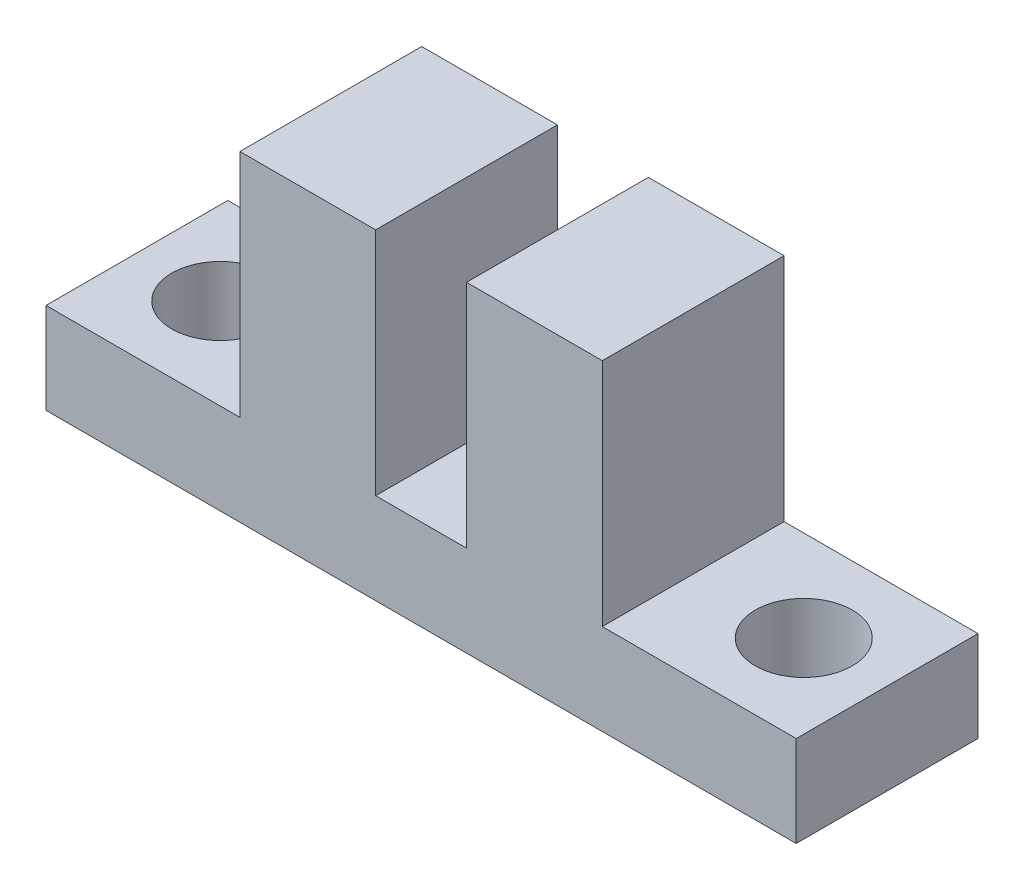
ISO-10303-21;
HEADER;
FILE_DESCRIPTION(('STEP AP214'),'2;1');
FILE_NAME('part.step','',(''),(''),'','','');
FILE_SCHEMA(('AUTOMOTIVE_DESIGN { 1 0 10303 214 1 1 1 1 }'));
ENDSEC;
DATA;
#1=APPLICATION_CONTEXT('core data for automotive mechanical design processes');
#2=APPLICATION_PROTOCOL_DEFINITION('international standard','automotive_design',2000,#1);
#3=PRODUCT_CONTEXT('',#1,'mechanical');
#4=PRODUCT('Part','Part','',(#3));
#5=PRODUCT_RELATED_PRODUCT_CATEGORY('part','',(#4));
#6=PRODUCT_DEFINITION_FORMATION('','',#4);
#7=PRODUCT_DEFINITION_CONTEXT('part definition',#1,'design');
#8=PRODUCT_DEFINITION('design','',#6,#7);
#9=PRODUCT_DEFINITION_SHAPE('','',#8);
#10=(LENGTH_UNIT() NAMED_UNIT(*) SI_UNIT(.MILLI.,.METRE.));
#11=(NAMED_UNIT(*) PLANE_ANGLE_UNIT() SI_UNIT($,.RADIAN.));
#12=(NAMED_UNIT(*) SI_UNIT($,.STERADIAN.) SOLID_ANGLE_UNIT());
#13=UNCERTAINTY_MEASURE_WITH_UNIT(LENGTH_MEASURE(1.E-05),#10,'distance_accuracy_value','');
#14=(GEOMETRIC_REPRESENTATION_CONTEXT(3) GLOBAL_UNCERTAINTY_ASSIGNED_CONTEXT((#13)) GLOBAL_UNIT_ASSIGNED_CONTEXT((#10,
#11,#12)) REPRESENTATION_CONTEXT('',''));
#15=CARTESIAN_POINT('',(0.,0.,0.));
#16=DIRECTION('',(0.,0.,1.));
#17=DIRECTION('',(1.,0.,0.));
#18=AXIS2_PLACEMENT_3D('',#15,#16,#17);
#19=CARTESIAN_POINT('',(-9.46757575757575,-2.10181818181819,6.));
#20=DIRECTION('',(1.,0.,0.));
#21=DIRECTION('',(0.,0.,-1.));
#22=AXIS2_PLACEMENT_3D('',#19,#20,#21);
#23=PLANE('',#22);
#24=DIRECTION('',(0.,-1.,0.));
#25=VECTOR('',#24,1.);
#26=CARTESIAN_POINT('',(-9.46757575757575,-2.10181818181819,0.));
#27=LINE('',#26,#25);
#28=CARTESIAN_POINT('',(-9.46757575757575,5.49818181818181,0.));
#29=VERTEX_POINT('',#28);
#30=CARTESIAN_POINT('',(-9.46757575757575,-2.10181818181819,0.));
#31=VERTEX_POINT('',#30);
#32=EDGE_CURVE('E153',#29,#31,#27,.T.);
#33=ORIENTED_EDGE('',*,*,#32,.T.);
#34=DIRECTION('',(0.,0.,-1.));
#35=VECTOR('',#34,1.);
#36=CARTESIAN_POINT('',(-9.46757575757575,-2.10181818181819,6.));
#37=LINE('',#36,#35);
#38=CARTESIAN_POINT('',(-9.46757575757575,-2.10181818181819,6.));
#39=VERTEX_POINT('',#38);
#40=EDGE_CURVE('E11',#39,#31,#37,.T.);
#41=ORIENTED_EDGE('',*,*,#40,.F.);
#42=DIRECTION('',(0.,-1.,0.));
#43=VECTOR('',#42,1.);
#44=CARTESIAN_POINT('',(-9.46757575757575,-2.10181818181819,6.));
#45=LINE('',#44,#43);
#46=CARTESIAN_POINT('',(-9.46757575757575,5.49818181818181,6.));
#47=VERTEX_POINT('',#46);
#48=EDGE_CURVE('E176',#47,#39,#45,.T.);
#49=ORIENTED_EDGE('',*,*,#48,.F.);
#50=DIRECTION('',(0.,0.,-1.));
#51=VECTOR('',#50,1.);
#52=CARTESIAN_POINT('',(-9.46757575757575,5.49818181818181,6.));
#53=LINE('',#52,#51);
#54=EDGE_CURVE('E149',#47,#29,#53,.T.);
#55=ORIENTED_EDGE('',*,*,#54,.T.);
#56=EDGE_LOOP('',(#33,#41,#49,#55));
#57=FACE_BOUND('',#56,.T.);
#58=ADVANCED_FACE('F33',(#57),#23,.F.);
#59=CARTESIAN_POINT('',(-15.8675757575758,-2.10181818181819,6.));
#60=DIRECTION('',(0.,-1.,0.));
#61=DIRECTION('',(0.,0.,-1.));
#62=AXIS2_PLACEMENT_3D('',#59,#60,#61);
#63=PLANE('',#62);
#64=CARTESIAN_POINT('',(-13.1175757575758,-2.10181818181819,3.));
#65=DIRECTION('',(0.,1.,0.));
#66=DIRECTION('',(0.,0.,1.));
#67=AXIS2_PLACEMENT_3D('',#64,#65,#66);
#68=CIRCLE('',#67,1.6);
#69=CARTESIAN_POINT('',(-13.1175757575758,-2.10181818181819,4.6));
#70=VERTEX_POINT('',#69);
#71=EDGE_CURVE('E356',#70,#70,#68,.T.);
#72=ORIENTED_EDGE('',*,*,#71,.F.);
#73=EDGE_LOOP('',(#72));
#74=FACE_BOUND('',#73,.T.);
#75=DIRECTION('',(-1.,0.,0.));
#76=VECTOR('',#75,1.);
#77=CARTESIAN_POINT('',(-15.8675757575758,-2.10181818181819,0.));
#78=LINE('',#77,#76);
#79=CARTESIAN_POINT('',(-15.8675757575758,-2.10181818181819,0.));
#80=VERTEX_POINT('',#79);
#81=EDGE_CURVE('E156',#31,#80,#78,.T.);
#82=ORIENTED_EDGE('',*,*,#81,.T.);
#83=DIRECTION('',(0.,0.,-1.));
#84=VECTOR('',#83,1.);
#85=CARTESIAN_POINT('',(-15.8675757575758,-2.10181818181819,6.));
#86=LINE('',#85,#84);
#87=CARTESIAN_POINT('',(-15.8675757575758,-2.10181818181819,6.));
#88=VERTEX_POINT('',#87);
#89=EDGE_CURVE('E41',#88,#80,#86,.T.);
#90=ORIENTED_EDGE('',*,*,#89,.F.);
#91=DIRECTION('',(-1.,0.,0.));
#92=VECTOR('',#91,1.);
#93=CARTESIAN_POINT('',(-15.8675757575758,-2.10181818181819,6.));
#94=LINE('',#93,#92);
#95=EDGE_CURVE('E104',#39,#88,#94,.T.);
#96=ORIENTED_EDGE('',*,*,#95,.F.);
#97=ORIENTED_EDGE('',*,*,#40,.T.);
#98=EDGE_LOOP('',(#82,#90,#96,#97));
#99=FACE_BOUND('',#98,.T.);
#100=ADVANCED_FACE('F254',(#74,#99),#63,.F.);
#101=CARTESIAN_POINT('',(-15.8675757575758,-5.10181818181819,6.));
#102=DIRECTION('',(1.,0.,0.));
#103=DIRECTION('',(0.,0.,-1.));
#104=AXIS2_PLACEMENT_3D('',#101,#102,#103);
#105=PLANE('',#104);
#106=DIRECTION('',(0.,-1.,0.));
#107=VECTOR('',#106,1.);
#108=CARTESIAN_POINT('',(-15.8675757575758,-5.10181818181819,0.));
#109=LINE('',#108,#107);
#110=CARTESIAN_POINT('',(-15.8675757575758,-5.10181818181819,0.));
#111=VERTEX_POINT('',#110);
#112=EDGE_CURVE('E159',#80,#111,#109,.T.);
#113=ORIENTED_EDGE('',*,*,#112,.T.);
#114=DIRECTION('',(0.,0.,-1.));
#115=VECTOR('',#114,1.);
#116=CARTESIAN_POINT('',(-15.8675757575758,-5.10181818181819,6.));
#117=LINE('',#116,#115);
#118=CARTESIAN_POINT('',(-15.8675757575758,-5.10181818181819,6.));
#119=VERTEX_POINT('',#118);
#120=EDGE_CURVE('E195',#119,#111,#117,.T.);
#121=ORIENTED_EDGE('',*,*,#120,.F.);
#122=DIRECTION('',(0.,-1.,0.));
#123=VECTOR('',#122,1.);
#124=CARTESIAN_POINT('',(-15.8675757575758,-5.10181818181819,6.));
#125=LINE('',#124,#123);
#126=EDGE_CURVE('E203',#88,#119,#125,.T.);
#127=ORIENTED_EDGE('',*,*,#126,.F.);
#128=ORIENTED_EDGE('',*,*,#89,.T.);
#129=EDGE_LOOP('',(#113,#121,#127,#128));
#130=FACE_BOUND('',#129,.T.);
#131=ADVANCED_FACE('F201',(#130),#105,.F.);
#132=CARTESIAN_POINT('',(8.89242424242425,-5.10181818181818,6.));
#133=DIRECTION('',(0.,1.,0.));
#134=DIRECTION('',(-1.,0.,0.));
#135=AXIS2_PLACEMENT_3D('',#132,#133,#134);
#136=PLANE('',#135);
#137=CARTESIAN_POINT('',(-13.1175757575758,-5.10181818181819,3.));
#138=DIRECTION('',(0.,1.,0.));
#139=DIRECTION('',(0.,0.,1.));
#140=AXIS2_PLACEMENT_3D('',#137,#138,#139);
#141=CIRCLE('',#140,1.6);
#142=CARTESIAN_POINT('',(-13.1175757575758,-5.10181818181819,4.6));
#143=VERTEX_POINT('',#142);
#144=EDGE_CURVE('E157',#143,#143,#141,.T.);
#145=ORIENTED_EDGE('',*,*,#144,.T.);
#146=EDGE_LOOP('',(#145));
#147=FACE_BOUND('',#146,.T.);
#148=CARTESIAN_POINT('',(6.14242424242425,-5.10181818181819,3.));
#149=DIRECTION('',(0.,1.,0.));
#150=DIRECTION('',(0.,0.,-1.));
#151=AXIS2_PLACEMENT_3D('',#148,#149,#150);
#152=CIRCLE('',#151,1.6);
#153=CARTESIAN_POINT('',(6.14242424242425,-5.10181818181819,1.4));
#154=VERTEX_POINT('',#153);
#155=EDGE_CURVE('E357',#154,#154,#152,.T.);
#156=ORIENTED_EDGE('',*,*,#155,.T.);
#157=EDGE_LOOP('',(#156));
#158=FACE_BOUND('',#157,.T.);
#159=DIRECTION('',(1.,0.,0.));
#160=VECTOR('',#159,1.);
#161=CARTESIAN_POINT('',(8.89242424242425,-5.10181818181818,0.));
#162=LINE('',#161,#160);
#163=CARTESIAN_POINT('',(8.89242424242425,-5.10181818181818,0.));
#164=VERTEX_POINT('',#163);
#165=EDGE_CURVE('E161',#111,#164,#162,.T.);
#166=ORIENTED_EDGE('',*,*,#165,.T.);
#167=DIRECTION('',(0.,0.,-1.));
#168=VECTOR('',#167,1.);
#169=CARTESIAN_POINT('',(8.89242424242425,-5.10181818181818,6.));
#170=LINE('',#169,#168);
#171=CARTESIAN_POINT('',(8.89242424242425,-5.10181818181818,6.));
#172=VERTEX_POINT('',#171);
#173=EDGE_CURVE('E192',#172,#164,#170,.T.);
#174=ORIENTED_EDGE('',*,*,#173,.F.);
#175=DIRECTION('',(1.,0.,0.));
#176=VECTOR('',#175,1.);
#177=CARTESIAN_POINT('',(8.89242424242425,-5.10181818181818,6.));
#178=LINE('',#177,#176);
#179=EDGE_CURVE('E221',#119,#172,#178,.T.);
#180=ORIENTED_EDGE('',*,*,#179,.F.);
#181=ORIENTED_EDGE('',*,*,#120,.T.);
#182=EDGE_LOOP('',(#166,#174,#180,#181));
#183=FACE_BOUND('',#182,.T.);
#184=ADVANCED_FACE('F212',(#147,#158,#183),#136,.F.);
#185=CARTESIAN_POINT('',(8.89242424242425,-2.10181818181819,6.));
#186=DIRECTION('',(-1.,0.,0.));
#187=DIRECTION('',(0.,0.,1.));
#188=AXIS2_PLACEMENT_3D('',#185,#186,#187);
#189=PLANE('',#188);
#190=DIRECTION('',(0.,1.,0.));
#191=VECTOR('',#190,1.);
#192=CARTESIAN_POINT('',(8.89242424242425,-2.10181818181819,0.));
#193=LINE('',#192,#191);
#194=CARTESIAN_POINT('',(8.89242424242425,-2.10181818181819,0.));
#195=VERTEX_POINT('',#194);
#196=EDGE_CURVE('E163',#164,#195,#193,.T.);
#197=ORIENTED_EDGE('',*,*,#196,.T.);
#198=DIRECTION('',(0.,0.,-1.));
#199=VECTOR('',#198,1.);
#200=CARTESIAN_POINT('',(8.89242424242425,-2.10181818181819,6.));
#201=LINE('',#200,#199);
#202=CARTESIAN_POINT('',(8.89242424242425,-2.10181818181819,6.));
#203=VERTEX_POINT('',#202);
#204=EDGE_CURVE('E189',#203,#195,#201,.T.);
#205=ORIENTED_EDGE('',*,*,#204,.F.);
#206=DIRECTION('',(0.,1.,0.));
#207=VECTOR('',#206,1.);
#208=CARTESIAN_POINT('',(8.89242424242425,-2.10181818181819,6.));
#209=LINE('',#208,#207);
#210=EDGE_CURVE('E218',#172,#203,#209,.T.);
#211=ORIENTED_EDGE('',*,*,#210,.F.);
#212=ORIENTED_EDGE('',*,*,#173,.T.);
#213=EDGE_LOOP('',(#197,#205,#211,#212));
#214=FACE_BOUND('',#213,.T.);
#215=ADVANCED_FACE('F216',(#214),#189,.F.);
#216=CARTESIAN_POINT('',(2.49242424242425,-2.10181818181819,6.));
#217=DIRECTION('',(0.,-1.,0.));
#218=DIRECTION('',(0.,0.,-1.));
#219=AXIS2_PLACEMENT_3D('',#216,#217,#218);
#220=PLANE('',#219);
#221=CARTESIAN_POINT('',(6.14242424242425,-2.10181818181819,3.));
#222=DIRECTION('',(0.,1.,0.));
#223=DIRECTION('',(0.,0.,-1.));
#224=AXIS2_PLACEMENT_3D('',#221,#222,#223);
#225=CIRCLE('',#224,1.6);
#226=CARTESIAN_POINT('',(6.14242424242425,-2.10181818181819,1.4));
#227=VERTEX_POINT('',#226);
#228=EDGE_CURVE('E361',#227,#227,#225,.T.);
#229=ORIENTED_EDGE('',*,*,#228,.F.);
#230=EDGE_LOOP('',(#229));
#231=FACE_BOUND('',#230,.T.);
#232=DIRECTION('',(-1.,0.,0.));
#233=VECTOR('',#232,1.);
#234=CARTESIAN_POINT('',(2.49242424242425,-2.10181818181819,0.));
#235=LINE('',#234,#233);
#236=CARTESIAN_POINT('',(2.49242424242425,-2.10181818181819,0.));
#237=VERTEX_POINT('',#236);
#238=EDGE_CURVE('E165',#195,#237,#235,.T.);
#239=ORIENTED_EDGE('',*,*,#238,.T.);
#240=DIRECTION('',(0.,0.,-1.));
#241=VECTOR('',#240,1.);
#242=CARTESIAN_POINT('',(2.49242424242425,-2.10181818181819,6.));
#243=LINE('',#242,#241);
#244=CARTESIAN_POINT('',(2.49242424242425,-2.10181818181819,6.));
#245=VERTEX_POINT('',#244);
#246=EDGE_CURVE('E186',#245,#237,#243,.T.);
#247=ORIENTED_EDGE('',*,*,#246,.F.);
#248=DIRECTION('',(-1.,0.,0.));
#249=VECTOR('',#248,1.);
#250=CARTESIAN_POINT('',(2.49242424242425,-2.10181818181819,6.));
#251=LINE('',#250,#249);
#252=EDGE_CURVE('E220',#203,#245,#251,.T.);
#253=ORIENTED_EDGE('',*,*,#252,.F.);
#254=ORIENTED_EDGE('',*,*,#204,.T.);
#255=EDGE_LOOP('',(#239,#247,#253,#254));
#256=FACE_BOUND('',#255,.T.);
#257=ADVANCED_FACE('F270',(#231,#256),#220,.F.);
#258=CARTESIAN_POINT('',(2.49242424242425,5.49818181818181,6.));
#259=DIRECTION('',(-1.,0.,0.));
#260=DIRECTION('',(0.,-1.,0.));
#261=AXIS2_PLACEMENT_3D('',#258,#259,#260);
#262=PLANE('',#261);
#263=DIRECTION('',(0.,1.,0.));
#264=VECTOR('',#263,1.);
#265=CARTESIAN_POINT('',(2.49242424242425,5.49818181818181,0.));
#266=LINE('',#265,#264);
#267=CARTESIAN_POINT('',(2.49242424242425,5.49818181818181,0.));
#268=VERTEX_POINT('',#267);
#269=EDGE_CURVE('E167',#237,#268,#266,.T.);
#270=ORIENTED_EDGE('',*,*,#269,.T.);
#271=DIRECTION('',(0.,0.,-1.));
#272=VECTOR('',#271,1.);
#273=CARTESIAN_POINT('',(2.49242424242425,5.49818181818181,6.));
#274=LINE('',#273,#272);
#275=CARTESIAN_POINT('',(2.49242424242425,5.49818181818181,6.));
#276=VERTEX_POINT('',#275);
#277=EDGE_CURVE('E183',#276,#268,#274,.T.);
#278=ORIENTED_EDGE('',*,*,#277,.F.);
#279=DIRECTION('',(0.,1.,0.));
#280=VECTOR('',#279,1.);
#281=CARTESIAN_POINT('',(2.49242424242425,5.49818181818181,6.));
#282=LINE('',#281,#280);
#283=EDGE_CURVE('E223',#245,#276,#282,.T.);
#284=ORIENTED_EDGE('',*,*,#283,.F.);
#285=ORIENTED_EDGE('',*,*,#246,.T.);
#286=EDGE_LOOP('',(#270,#278,#284,#285));
#287=FACE_BOUND('',#286,.T.);
#288=ADVANCED_FACE('F273',(#287),#262,.F.);
#289=CARTESIAN_POINT('',(-1.98757575757575,5.49818181818181,6.));
#290=DIRECTION('',(0.,-1.,0.));
#291=DIRECTION('',(0.,0.,-1.));
#292=AXIS2_PLACEMENT_3D('',#289,#290,#291);
#293=PLANE('',#292);
#294=DIRECTION('',(-1.,0.,0.));
#295=VECTOR('',#294,1.);
#296=CARTESIAN_POINT('',(-1.98757575757575,5.49818181818181,0.));
#297=LINE('',#296,#295);
#298=CARTESIAN_POINT('',(-1.98757575757575,5.49818181818181,0.));
#299=VERTEX_POINT('',#298);
#300=EDGE_CURVE('E169',#268,#299,#297,.T.);
#301=ORIENTED_EDGE('',*,*,#300,.T.);
#302=DIRECTION('',(0.,0.,-1.));
#303=VECTOR('',#302,1.);
#304=CARTESIAN_POINT('',(-1.98757575757575,5.49818181818181,6.));
#305=LINE('',#304,#303);
#306=CARTESIAN_POINT('',(-1.98757575757575,5.49818181818181,6.));
#307=VERTEX_POINT('',#306);
#308=EDGE_CURVE('E180',#307,#299,#305,.T.);
#309=ORIENTED_EDGE('',*,*,#308,.F.);
#310=DIRECTION('',(-1.,0.,0.));
#311=VECTOR('',#310,1.);
#312=CARTESIAN_POINT('',(-1.98757575757575,5.49818181818181,6.));
#313=LINE('',#312,#311);
#314=EDGE_CURVE('E229',#276,#307,#313,.T.);
#315=ORIENTED_EDGE('',*,*,#314,.F.);
#316=ORIENTED_EDGE('',*,*,#277,.T.);
#317=EDGE_LOOP('',(#301,#309,#315,#316));
#318=FACE_BOUND('',#317,.T.);
#319=ADVANCED_FACE('F235',(#318),#293,.F.);
#320=CARTESIAN_POINT('',(-1.98757575757575,-2.10181818181819,6.));
#321=DIRECTION('',(1.,0.,0.));
#322=DIRECTION('',(0.,0.,-1.));
#323=AXIS2_PLACEMENT_3D('',#320,#321,#322);
#324=PLANE('',#323);
#325=DIRECTION('',(0.,-1.,0.));
#326=VECTOR('',#325,1.);
#327=CARTESIAN_POINT('',(-1.98757575757575,-2.10181818181819,0.));
#328=LINE('',#327,#326);
#329=CARTESIAN_POINT('',(-1.98757575757575,-2.10181818181819,0.));
#330=VERTEX_POINT('',#329);
#331=EDGE_CURVE('E171',#299,#330,#328,.T.);
#332=ORIENTED_EDGE('',*,*,#331,.T.);
#333=DIRECTION('',(0.,0.,-1.));
#334=VECTOR('',#333,1.);
#335=CARTESIAN_POINT('',(-1.98757575757575,-2.10181818181819,6.));
#336=LINE('',#335,#334);
#337=CARTESIAN_POINT('',(-1.98757575757575,-2.10181818181819,6.));
#338=VERTEX_POINT('',#337);
#339=EDGE_CURVE('E144',#338,#330,#336,.T.);
#340=ORIENTED_EDGE('',*,*,#339,.F.);
#341=DIRECTION('',(0.,-1.,0.));
#342=VECTOR('',#341,1.);
#343=CARTESIAN_POINT('',(-1.98757575757575,-2.10181818181819,6.));
#344=LINE('',#343,#342);
#345=EDGE_CURVE('E135',#307,#338,#344,.T.);
#346=ORIENTED_EDGE('',*,*,#345,.F.);
#347=ORIENTED_EDGE('',*,*,#308,.T.);
#348=EDGE_LOOP('',(#332,#340,#346,#347));
#349=FACE_BOUND('',#348,.T.);
#350=ADVANCED_FACE('F239',(#349),#324,.F.);
#351=CARTESIAN_POINT('',(-4.98757575757575,-2.10181818181819,6.));
#352=DIRECTION('',(0.,-1.,0.));
#353=DIRECTION('',(0.,0.,-1.));
#354=AXIS2_PLACEMENT_3D('',#351,#352,#353);
#355=PLANE('',#354);
#356=DIRECTION('',(-1.,0.,0.));
#357=VECTOR('',#356,1.);
#358=CARTESIAN_POINT('',(-4.98757575757575,-2.10181818181819,0.));
#359=LINE('',#358,#357);
#360=CARTESIAN_POINT('',(-4.98757575757575,-2.10181818181819,0.));
#361=VERTEX_POINT('',#360);
#362=EDGE_CURVE('E143',#330,#361,#359,.T.);
#363=ORIENTED_EDGE('',*,*,#362,.T.);
#364=DIRECTION('',(0.,0.,-1.));
#365=VECTOR('',#364,1.);
#366=CARTESIAN_POINT('',(-4.98757575757575,-2.10181818181819,6.));
#367=LINE('',#366,#365);
#368=CARTESIAN_POINT('',(-4.98757575757575,-2.10181818181819,6.));
#369=VERTEX_POINT('',#368);
#370=EDGE_CURVE('E140',#369,#361,#367,.T.);
#371=ORIENTED_EDGE('',*,*,#370,.F.);
#372=DIRECTION('',(-1.,0.,0.));
#373=VECTOR('',#372,1.);
#374=CARTESIAN_POINT('',(-4.98757575757575,-2.10181818181819,6.));
#375=LINE('',#374,#373);
#376=EDGE_CURVE('E129',#338,#369,#375,.T.);
#377=ORIENTED_EDGE('',*,*,#376,.F.);
#378=ORIENTED_EDGE('',*,*,#339,.T.);
#379=EDGE_LOOP('',(#363,#371,#377,#378));
#380=FACE_BOUND('',#379,.T.);
#381=ADVANCED_FACE('F141',(#380),#355,.F.);
#382=CARTESIAN_POINT('',(-4.98757575757575,5.49818181818181,6.));
#383=DIRECTION('',(-1.,0.,0.));
#384=DIRECTION('',(0.,-1.,0.));
#385=AXIS2_PLACEMENT_3D('',#382,#383,#384);
#386=PLANE('',#385);
#387=DIRECTION('',(0.,1.,0.));
#388=VECTOR('',#387,1.);
#389=CARTESIAN_POINT('',(-4.98757575757575,5.49818181818181,0.));
#390=LINE('',#389,#388);
#391=CARTESIAN_POINT('',(-4.98757575757575,5.49818181818181,0.));
#392=VERTEX_POINT('',#391);
#393=EDGE_CURVE('E90',#361,#392,#390,.T.);
#394=ORIENTED_EDGE('',*,*,#393,.T.);
#395=DIRECTION('',(0.,0.,-1.));
#396=VECTOR('',#395,1.);
#397=CARTESIAN_POINT('',(-4.98757575757575,5.49818181818181,6.));
#398=LINE('',#397,#396);
#399=CARTESIAN_POINT('',(-4.98757575757575,5.49818181818181,6.));
#400=VERTEX_POINT('',#399);
#401=EDGE_CURVE('E145',#400,#392,#398,.T.);
#402=ORIENTED_EDGE('',*,*,#401,.F.);
#403=DIRECTION('',(0.,1.,0.));
#404=VECTOR('',#403,1.);
#405=CARTESIAN_POINT('',(-4.98757575757575,5.49818181818181,6.));
#406=LINE('',#405,#404);
#407=EDGE_CURVE('E133',#369,#400,#406,.T.);
#408=ORIENTED_EDGE('',*,*,#407,.F.);
#409=ORIENTED_EDGE('',*,*,#370,.T.);
#410=EDGE_LOOP('',(#394,#402,#408,#409));
#411=FACE_BOUND('',#410,.T.);
#412=ADVANCED_FACE('F147',(#411),#386,.F.);
#413=CARTESIAN_POINT('',(-9.46757575757575,5.49818181818181,6.));
#414=DIRECTION('',(0.,-1.,0.));
#415=DIRECTION('',(0.,0.,-1.));
#416=AXIS2_PLACEMENT_3D('',#413,#414,#415);
#417=PLANE('',#416);
#418=DIRECTION('',(-1.,0.,0.));
#419=VECTOR('',#418,1.);
#420=CARTESIAN_POINT('',(-9.46757575757575,5.49818181818181,0.));
#421=LINE('',#420,#419);
#422=EDGE_CURVE('E96',#392,#29,#421,.T.);
#423=ORIENTED_EDGE('',*,*,#422,.T.);
#424=ORIENTED_EDGE('',*,*,#54,.F.);
#425=DIRECTION('',(-1.,0.,0.));
#426=VECTOR('',#425,1.);
#427=CARTESIAN_POINT('',(-9.46757575757575,5.49818181818181,6.));
#428=LINE('',#427,#426);
#429=EDGE_CURVE('E49',#400,#47,#428,.T.);
#430=ORIENTED_EDGE('',*,*,#429,.F.);
#431=ORIENTED_EDGE('',*,*,#401,.T.);
#432=EDGE_LOOP('',(#423,#424,#430,#431));
#433=FACE_BOUND('',#432,.T.);
#434=ADVANCED_FACE('F243',(#433),#417,.F.);
#435=CARTESIAN_POINT('',(0.,0.,6.));
#436=DIRECTION('',(0.,0.,-1.));
#437=DIRECTION('',(-1.,0.,0.));
#438=AXIS2_PLACEMENT_3D('',#435,#436,#437);
#439=PLANE('',#438);
#440=ORIENTED_EDGE('',*,*,#48,.T.);
#441=ORIENTED_EDGE('',*,*,#95,.T.);
#442=ORIENTED_EDGE('',*,*,#126,.T.);
#443=ORIENTED_EDGE('',*,*,#179,.T.);
#444=ORIENTED_EDGE('',*,*,#210,.T.);
#445=ORIENTED_EDGE('',*,*,#252,.T.);
#446=ORIENTED_EDGE('',*,*,#283,.T.);
#447=ORIENTED_EDGE('',*,*,#314,.T.);
#448=ORIENTED_EDGE('',*,*,#345,.T.);
#449=ORIENTED_EDGE('',*,*,#376,.T.);
#450=ORIENTED_EDGE('',*,*,#407,.T.);
#451=ORIENTED_EDGE('',*,*,#429,.T.);
#452=EDGE_LOOP('',(#440,#441,#442,#443,#444,#445,#446,#447,#448,#449,#450,#451));
#453=FACE_BOUND('',#452,.T.);
#454=ADVANCED_FACE('F131',(#453),#439,.F.);
#455=CARTESIAN_POINT('',(0.,0.,0.));
#456=DIRECTION('',(0.,0.,-1.));
#457=DIRECTION('',(-1.,0.,0.));
#458=AXIS2_PLACEMENT_3D('',#455,#456,#457);
#459=PLANE('',#458);
#460=ORIENTED_EDGE('',*,*,#32,.F.);
#461=ORIENTED_EDGE('',*,*,#422,.F.);
#462=ORIENTED_EDGE('',*,*,#393,.F.);
#463=ORIENTED_EDGE('',*,*,#362,.F.);
#464=ORIENTED_EDGE('',*,*,#331,.F.);
#465=ORIENTED_EDGE('',*,*,#300,.F.);
#466=ORIENTED_EDGE('',*,*,#269,.F.);
#467=ORIENTED_EDGE('',*,*,#238,.F.);
#468=ORIENTED_EDGE('',*,*,#196,.F.);
#469=ORIENTED_EDGE('',*,*,#165,.F.);
#470=ORIENTED_EDGE('',*,*,#112,.F.);
#471=ORIENTED_EDGE('',*,*,#81,.F.);
#472=EDGE_LOOP('',(#460,#461,#462,#463,#464,#465,#466,#467,#468,#469,#470,#471));
#473=FACE_BOUND('',#472,.T.);
#474=ADVANCED_FACE('F207',(#473),#459,.T.);
#475=CARTESIAN_POINT('',(6.14242424242425,-5.10181818181819,3.));
#476=DIRECTION('',(0.,1.,0.));
#477=DIRECTION('',(0.,0.,1.));
#478=AXIS2_PLACEMENT_3D('',#475,#476,#477);
#479=CYLINDRICAL_SURFACE('',#478,1.6);
#480=ORIENTED_EDGE('',*,*,#155,.F.);
#481=EDGE_LOOP('',(#480));
#482=FACE_BOUND('',#481,.T.);
#483=ORIENTED_EDGE('',*,*,#228,.T.);
#484=EDGE_LOOP('',(#483));
#485=FACE_BOUND('',#484,.T.);
#486=ADVANCED_FACE('F309',(#482,#485),#479,.F.);
#487=CARTESIAN_POINT('',(-13.1175757575758,-5.10181818181819,3.));
#488=DIRECTION('',(0.,1.,0.));
#489=DIRECTION('',(0.,0.,1.));
#490=AXIS2_PLACEMENT_3D('',#487,#488,#489);
#491=CYLINDRICAL_SURFACE('',#490,1.6);
#492=ORIENTED_EDGE('',*,*,#144,.F.);
#493=EDGE_LOOP('',(#492));
#494=FACE_BOUND('',#493,.T.);
#495=ORIENTED_EDGE('',*,*,#71,.T.);
#496=EDGE_LOOP('',(#495));
#497=FACE_BOUND('',#496,.T.);
#498=ADVANCED_FACE('F338',(#494,#497),#491,.F.);
#499=CLOSED_SHELL('',(#58,#100,#131,#184,#215,#257,#288,#319,#350,#381,#412,#434,#454,#474,#486,#498));
#500=MANIFOLD_SOLID_BREP('B2',#499);
#501=ADVANCED_BREP_SHAPE_REPRESENTATION('',(#18,#500),#14);
#502=SHAPE_DEFINITION_REPRESENTATION(#9,#501);
ENDSEC;
END-ISO-10303-21;
